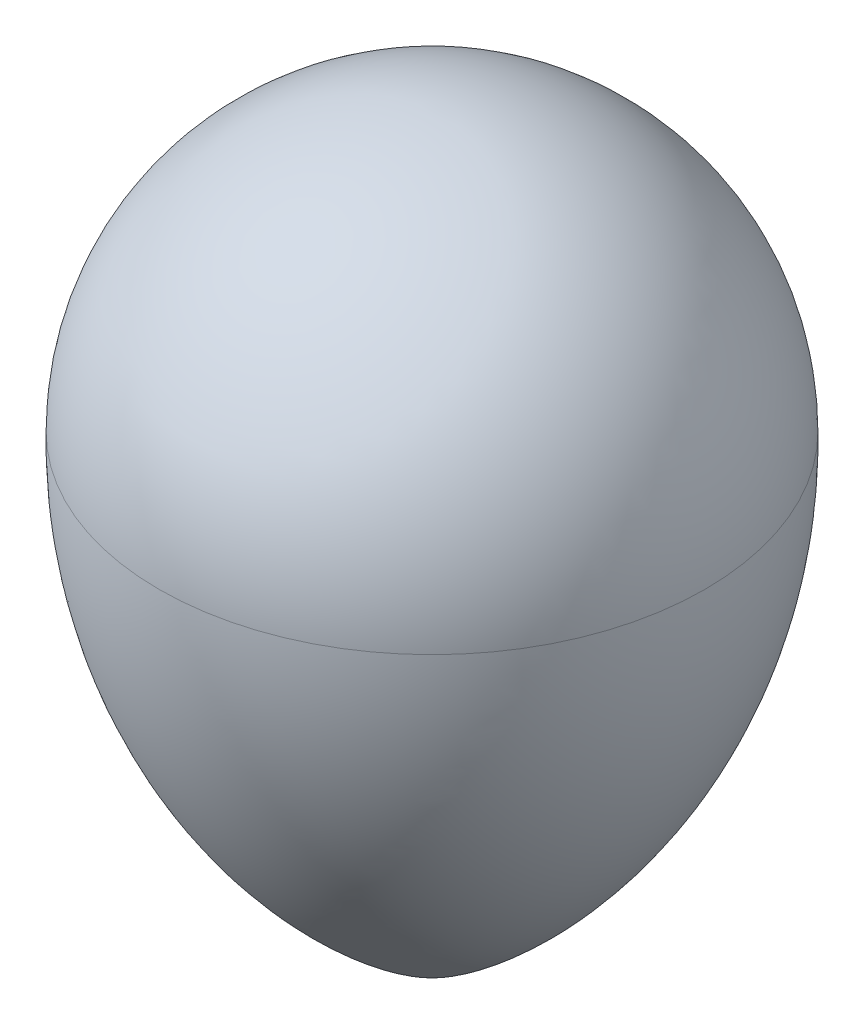
ISO-10303-21;
HEADER;
FILE_DESCRIPTION(('STEP AP214'),'2;1');
FILE_NAME('part.step','',(''),(''),'','','');
FILE_SCHEMA(('AUTOMOTIVE_DESIGN { 1 0 10303 214 1 1 1 1 }'));
ENDSEC;
DATA;
#1=APPLICATION_CONTEXT('core data for automotive mechanical design processes');
#2=APPLICATION_PROTOCOL_DEFINITION('international standard','automotive_design',2000,#1);
#3=PRODUCT_CONTEXT('',#1,'mechanical');
#4=PRODUCT('Part','Part','',(#3));
#5=PRODUCT_RELATED_PRODUCT_CATEGORY('part','',(#4));
#6=PRODUCT_DEFINITION_FORMATION('','',#4);
#7=PRODUCT_DEFINITION_CONTEXT('part definition',#1,'design');
#8=PRODUCT_DEFINITION('design','',#6,#7);
#9=PRODUCT_DEFINITION_SHAPE('','',#8);
#10=(LENGTH_UNIT() NAMED_UNIT(*) SI_UNIT(.MILLI.,.METRE.));
#11=(NAMED_UNIT(*) PLANE_ANGLE_UNIT() SI_UNIT($,.RADIAN.));
#12=(NAMED_UNIT(*) SI_UNIT($,.STERADIAN.) SOLID_ANGLE_UNIT());
#13=UNCERTAINTY_MEASURE_WITH_UNIT(LENGTH_MEASURE(1.E-05),#10,'distance_accuracy_value','');
#14=(GEOMETRIC_REPRESENTATION_CONTEXT(3) GLOBAL_UNCERTAINTY_ASSIGNED_CONTEXT((#13)) GLOBAL_UNIT_ASSIGNED_CONTEXT((#10,
#11,#12)) REPRESENTATION_CONTEXT('',''));
#15=CARTESIAN_POINT('',(0.,0.,0.));
#16=DIRECTION('',(0.,0.,1.));
#17=DIRECTION('',(1.,0.,0.));
#18=AXIS2_PLACEMENT_3D('',#15,#16,#17);
#19=CARTESIAN_POINT('',(0.,0.,0.));
#20=DIRECTION('',(0.,1.,0.));
#21=DIRECTION('',(1.,0.,0.));
#22=AXIS2_PLACEMENT_3D('',#19,#20,#21);
#23=SPHERICAL_SURFACE('',#22,93.4528301886793);
#24=CARTESIAN_POINT('',(0.,0.,0.));
#25=DIRECTION('',(0.,1.,0.));
#26=DIRECTION('',(0.,0.,1.));
#27=AXIS2_PLACEMENT_3D('',#24,#25,#26);
#28=CIRCLE('',#27,93.4528301886793);
#29=CARTESIAN_POINT('',(0.,0.,93.4528301886793));
#30=VERTEX_POINT('',#29);
#31=EDGE_CURVE('E11',#30,#30,#28,.T.);
#32=ORIENTED_EDGE('',*,*,#31,.T.);
#33=EDGE_LOOP('',(#32));
#34=FACE_BOUND('',#33,.T.);
#35=ADVANCED_FACE('F34',(#34),#23,.T.);
#36=CARTESIAN_POINT('',(0.,-2.57596314751334,-86.7541145927334));
#37=DIRECTION('',(-1.,0.,0.));
#38=DIRECTION('',(0.,0.,1.));
#39=AXIS2_PLACEMENT_3D('',#36,#37,#38);
#40=CIRCLE('',#39,180.225354857713);
#41=TRIMMED_CURVE('',#40,(PARAMETER_VALUE(-1.06858538580371)),
(PARAMETER_VALUE(1.06858538580371)),.T.,.PARAMETER.);
#42=CARTESIAN_POINT('',(0.,-2.57596314751334,0.));
#43=DIRECTION('',(0.,1.,0.));
#44=AXIS1_PLACEMENT('',#42,#43);
#45=SURFACE_OF_REVOLUTION('',#41,#44);
#46=ORIENTED_EDGE('',*,*,#31,.F.);
#47=EDGE_LOOP('',(#46));
#48=FACE_BOUND('',#47,.T.);
#49=CARTESIAN_POINT('',(0.,-160.547169811321,0.));
#50=VERTEX_POINT('',#49);
#51=VERTEX_LOOP('',#50);
#52=FACE_BOUND('',#51,.T.);
#53=ADVANCED_FACE('F41',(#48,#52),#45,.T.);
#54=CLOSED_SHELL('',(#35,#53));
#55=MANIFOLD_SOLID_BREP('B2',#54);
#56=ADVANCED_BREP_SHAPE_REPRESENTATION('',(#18,#55),#14);
#57=SHAPE_DEFINITION_REPRESENTATION(#9,#56);
ENDSEC;
END-ISO-10303-21;
